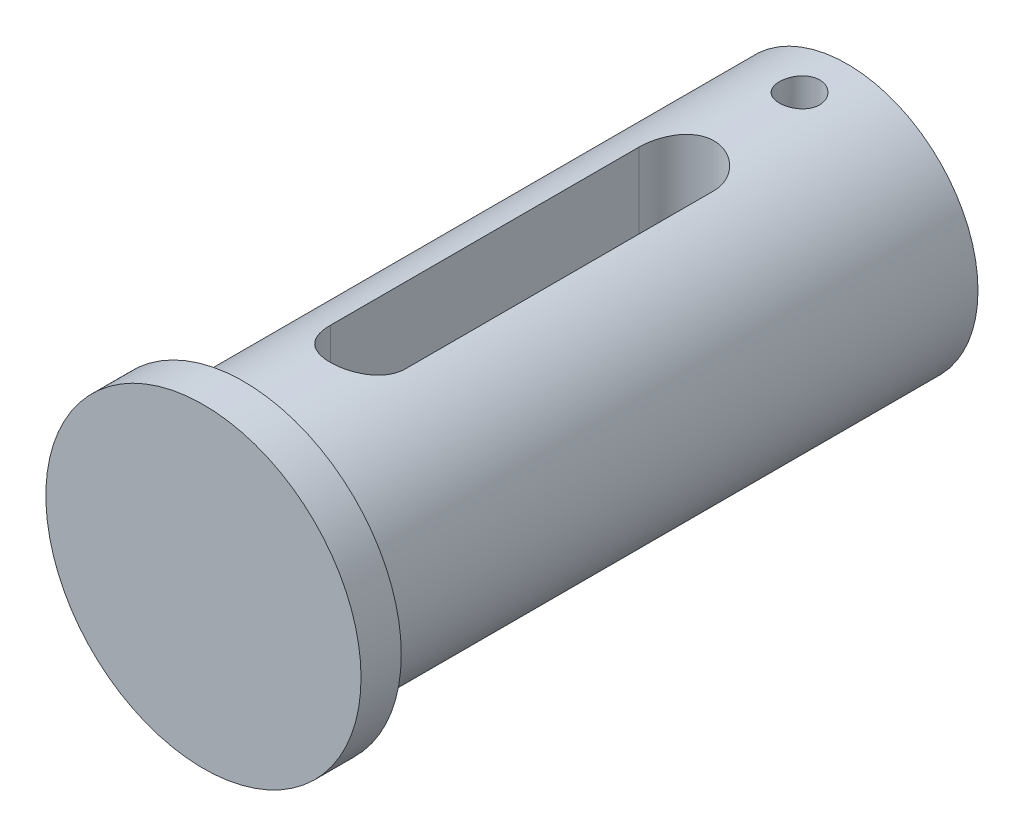
ISO-10303-21;
HEADER;
FILE_DESCRIPTION(('STEP AP214'),'2;1');
FILE_NAME('part.step','',(''),(''),'','','');
FILE_SCHEMA(('AUTOMOTIVE_DESIGN { 1 0 10303 214 1 1 1 1 }'));
ENDSEC;
DATA;
#1=APPLICATION_CONTEXT('core data for automotive mechanical design processes');
#2=APPLICATION_PROTOCOL_DEFINITION('international standard','automotive_design',2000,#1);
#3=PRODUCT_CONTEXT('',#1,'mechanical');
#4=PRODUCT('Part','Part','',(#3));
#5=PRODUCT_RELATED_PRODUCT_CATEGORY('part','',(#4));
#6=PRODUCT_DEFINITION_FORMATION('','',#4);
#7=PRODUCT_DEFINITION_CONTEXT('part definition',#1,'design');
#8=PRODUCT_DEFINITION('design','',#6,#7);
#9=PRODUCT_DEFINITION_SHAPE('','',#8);
#10=(LENGTH_UNIT() NAMED_UNIT(*) SI_UNIT(.MILLI.,.METRE.));
#11=(NAMED_UNIT(*) PLANE_ANGLE_UNIT() SI_UNIT($,.RADIAN.));
#12=(NAMED_UNIT(*) SI_UNIT($,.STERADIAN.) SOLID_ANGLE_UNIT());
#13=UNCERTAINTY_MEASURE_WITH_UNIT(LENGTH_MEASURE(1.E-05),#10,'distance_accuracy_value','');
#14=(GEOMETRIC_REPRESENTATION_CONTEXT(3) GLOBAL_UNCERTAINTY_ASSIGNED_CONTEXT((#13)) GLOBAL_UNIT_ASSIGNED_CONTEXT((#10,
#11,#12)) REPRESENTATION_CONTEXT('',''));
#15=CARTESIAN_POINT('',(0.,0.,0.));
#16=DIRECTION('',(0.,0.,1.));
#17=DIRECTION('',(1.,0.,0.));
#18=AXIS2_PLACEMENT_3D('',#15,#16,#17);
#19=CARTESIAN_POINT('',(0.,0.,45.));
#20=DIRECTION('',(0.,0.,-1.));
#21=DIRECTION('',(-1.,0.,0.));
#22=AXIS2_PLACEMENT_3D('',#19,#20,#21);
#23=CYLINDRICAL_SURFACE('',#22,9.75);
#24=CARTESIAN_POINT('',(-2.80710702041458,-9.33716499671818,12.735));
#25=CARTESIAN_POINT('',(-2.80711647680859,-9.33715477742188,12.6578056548519));
#26=CARTESIAN_POINT('',(-2.80392296997313,-9.33812206146957,12.5806172546489));
#27=CARTESIAN_POINT('',(-2.79120356748797,-9.34193572861488,12.4268264438717));
#28=CARTESIAN_POINT('',(-2.78167900147615,-9.34478171714942,12.3502239136704));
#29=CARTESIAN_POINT('',(-2.75640116002428,-9.35226800118549,12.1983275260017));
#30=CARTESIAN_POINT('',(-2.74066280357456,-9.35690399838484,12.1230309816782));
#31=CARTESIAN_POINT('',(-2.70310975166272,-9.36782137665724,11.9741108087949));
#32=CARTESIAN_POINT('',(-2.68129491716196,-9.37410279537973,11.9004872185564));
#33=CARTESIAN_POINT('',(-2.60699605085356,-9.3951453236991,11.6829321374927));
#34=CARTESIAN_POINT('',(-2.5456269616611,-9.41211437899943,11.5421338033323));
#35=CARTESIAN_POINT('',(-2.40111225217474,-9.45001092865015,11.2728387979795));
#36=CARTESIAN_POINT('',(-2.31795759988312,-9.47094006379369,11.1443472592595));
#37=CARTESIAN_POINT('',(-2.12963899864431,-9.51507820443457,10.8995326536004));
#38=CARTESIAN_POINT('',(-2.02395536297638,-9.53833258423887,10.7836167349571));
#39=CARTESIAN_POINT('',(-1.79469264677145,-9.58411305896874,10.5708849139801));
#40=CARTESIAN_POINT('',(-1.67111059637553,-9.60663903227056,10.4740721877228));
#41=CARTESIAN_POINT('',(-1.40666980537554,-9.64893867910439,10.3005390685756));
#42=CARTESIAN_POINT('',(-1.2655286237994,-9.66865227157902,10.2242331092977));
#43=CARTESIAN_POINT('',(-0.971761663430288,-9.70257722469342,10.096598853699));
#44=CARTESIAN_POINT('',(-0.819138673724752,-9.7167899164553,10.0452645139083));
#45=CARTESIAN_POINT('',(-0.511022327549508,-9.73779024363499,9.97037125977107));
#46=CARTESIAN_POINT('',(-0.355711874834096,-9.74476445481694,9.94611312491561));
#47=CARTESIAN_POINT('',(-0.0430761739848334,-9.75115737767659,9.92385407234114));
#48=CARTESIAN_POINT('',(0.114248721122642,-9.75057739558418,9.925848615153));
#49=CARTESIAN_POINT('',(0.421550126993738,-9.74206068102095,9.95556127169312));
#50=CARTESIAN_POINT('',(0.571606767177678,-9.73434045666765,9.9825223731986));
#51=CARTESIAN_POINT('',(0.864966341279789,-9.71267108001026,10.0601710203097));
#52=CARTESIAN_POINT('',(1.00826893169759,-9.69872161127369,10.1108597712362));
#53=CARTESIAN_POINT('',(1.28590487519884,-9.66585350229041,10.2350628729369));
#54=CARTESIAN_POINT('',(1.42012151115726,-9.64688161393591,10.3088234530865));
#55=CARTESIAN_POINT('',(1.67451828528519,-9.605993614126,10.4768832351377));
#56=CARTESIAN_POINT('',(1.7946955210649,-9.58407689588724,10.5711866723975));
#57=CARTESIAN_POINT('',(2.02211210305129,-9.53873662892075,10.7816045714563));
#58=CARTESIAN_POINT('',(2.12874025382918,-9.51528720928965,10.8983747933271));
#59=CARTESIAN_POINT('',(2.32108702655957,-9.47020823335739,11.1484050166293));
#60=CARTESIAN_POINT('',(2.40679969585042,-9.44857919629187,11.2816696962474));
#61=CARTESIAN_POINT('',(2.55546347861915,-9.40946802583716,11.5624313050877));
#62=CARTESIAN_POINT('',(2.61820925726902,-9.39202376086784,11.7100423715092));
#63=CARTESIAN_POINT('',(2.71770427213954,-9.36372273622855,12.014269703408));
#64=CARTESIAN_POINT('',(2.75449295952414,-9.35285598324509,12.1708719101242));
#65=CARTESIAN_POINT('',(2.78746502690079,-9.34305180133204,12.396593432866));
#66=CARTESIAN_POINT('',(2.79483051689039,-9.34084872234885,12.4640971425756));
#67=CARTESIAN_POINT('',(2.80464678896056,-9.33790535601807,12.599389345066));
#68=CARTESIAN_POINT('',(2.80710502919143,-9.33716284888515,12.667177248534));
#69=CARTESIAN_POINT('',(2.80710702041458,-9.33716499671818,12.735));
#70=B_SPLINE_CURVE_WITH_KNOTS('',3,(#24,#25,#26,#27,#28,#29,#30,#31,#32,#33,#34,#35,#36,#37,#38,
#39,#40,#41,#42,#43,#44,#45,#46,#47,#48,#49,#50,#51,#52,#53,#54,#55,#56,#57,#58,#59,#60,#61,#62,
#63,#64,#65,#66,#67,#68,#69),.UNSPECIFIED.,.F.,.F.,(4,2,2,2,2,2,2,2,2,2,2,2,2,2,2,2,2,2,2,2,2,2,
4),(0.,0.231500791144603,0.462952978256511,0.693852807333934,0.92475792016815,1.38601909052326,
1.84747179693004,2.32101780142025,2.79464247094971,3.27722076113667,3.75968220266869,
4.22937341042641,4.69898340282231,5.15480475779302,5.61064927016218,6.07153497489144,
6.53251579134957,7.0098710226999,7.48736195394646,7.96902323195447,8.44995086572629,
8.65361133400684,8.85696203807849),.UNSPECIFIED.);
#71=CARTESIAN_POINT('',(-2.80710702041458,-9.33716499671818,12.735));
#72=VERTEX_POINT('',#71);
#73=CARTESIAN_POINT('',(2.80710702041458,-9.33716499671818,12.735));
#74=VERTEX_POINT('',#73);
#75=EDGE_CURVE('E108',#72,#74,#70,.T.);
#76=ORIENTED_EDGE('',*,*,#75,.F.);
#77=DIRECTION('',(0.,0.,-1.));
#78=VECTOR('',#77,1.);
#79=CARTESIAN_POINT('',(-2.80710702041458,-9.33716499671818,45.));
#80=LINE('',#79,#78);
#81=CARTESIAN_POINT('',(-2.80710702041458,-9.33716499671818,35.735));
#82=VERTEX_POINT('',#81);
#83=EDGE_CURVE('E106',#82,#72,#80,.T.);
#84=ORIENTED_EDGE('',*,*,#83,.F.);
#85=CARTESIAN_POINT('',(2.80710702041458,-9.33716499671818,35.735));
#86=CARTESIAN_POINT('',(2.80711647680859,-9.33715477742188,35.8121943451481));
#87=CARTESIAN_POINT('',(2.80392296997313,-9.33812206146957,35.8893827453511));
#88=CARTESIAN_POINT('',(2.79120356748797,-9.34193572861488,36.0431735561283));
#89=CARTESIAN_POINT('',(2.78167900147615,-9.34478171714942,36.1197760863296));
#90=CARTESIAN_POINT('',(2.75640116002428,-9.35226800118549,36.2716724739983));
#91=CARTESIAN_POINT('',(2.74066280357456,-9.35690399838484,36.3469690183218));
#92=CARTESIAN_POINT('',(2.70310975166272,-9.36782137665724,36.4958891912051));
#93=CARTESIAN_POINT('',(2.68129491716196,-9.37410279537973,36.5695127814436));
#94=CARTESIAN_POINT('',(2.60699605085356,-9.3951453236991,36.7870678625073));
#95=CARTESIAN_POINT('',(2.5456269616611,-9.41211437899943,36.9278661966677));
#96=CARTESIAN_POINT('',(2.40111225217474,-9.45001092865015,37.1971612020205));
#97=CARTESIAN_POINT('',(2.31795759988312,-9.4709400637937,37.3256527407405));
#98=CARTESIAN_POINT('',(2.1296389986443,-9.51507820443458,37.5704673463996));
#99=CARTESIAN_POINT('',(2.02395536297638,-9.53833258423887,37.6863832650429));
#100=CARTESIAN_POINT('',(1.79469264677145,-9.58411305896874,37.89911508602));
#101=CARTESIAN_POINT('',(1.67111059637553,-9.60663903227056,37.9959278122772));
#102=CARTESIAN_POINT('',(1.40666980537553,-9.64893867910439,38.1694609314244));
#103=CARTESIAN_POINT('',(1.2655286237994,-9.66865227157902,38.2457668907023));
#104=CARTESIAN_POINT('',(0.971761663430283,-9.70257722469342,38.373401146301));
#105=CARTESIAN_POINT('',(0.819138673724748,-9.7167899164553,38.4247354860917));
#106=CARTESIAN_POINT('',(0.511022327549504,-9.73779024363499,38.4996287402289));
#107=CARTESIAN_POINT('',(0.355711874834091,-9.74476445481694,38.5238868750844));
#108=CARTESIAN_POINT('',(0.0430761739848275,-9.75115737767659,38.5461459276589));
#109=CARTESIAN_POINT('',(-0.114248721122648,-9.75057739558418,38.544151384847));
#110=CARTESIAN_POINT('',(-0.421550126993743,-9.74206068102095,38.5144387283069));
#111=CARTESIAN_POINT('',(-0.571606767177684,-9.73434045666765,38.4874776268014));
#112=CARTESIAN_POINT('',(-0.864966341279795,-9.71267108001026,38.4098289796903));
#113=CARTESIAN_POINT('',(-1.00826893169759,-9.69872161127369,38.3591402287638));
#114=CARTESIAN_POINT('',(-1.28590487519885,-9.66585350229041,38.2349371270631));
#115=CARTESIAN_POINT('',(-1.42012151115727,-9.64688161393591,38.1611765469135));
#116=CARTESIAN_POINT('',(-1.6745182852852,-9.605993614126,37.9931167648624));
#117=CARTESIAN_POINT('',(-1.79469552106491,-9.58407689588724,37.8988133276026));
#118=CARTESIAN_POINT('',(-2.02211210305129,-9.53873662892075,37.6883954285437));
#119=CARTESIAN_POINT('',(-2.12874025382918,-9.51528720928965,37.571625206673));
#120=CARTESIAN_POINT('',(-2.32108702655957,-9.47020823335739,37.3215949833707));
#121=CARTESIAN_POINT('',(-2.40679969585042,-9.44857919629187,37.1883303037526));
#122=CARTESIAN_POINT('',(-2.55546347861915,-9.40946802583716,36.9075686949123));
#123=CARTESIAN_POINT('',(-2.61820925726903,-9.39202376086784,36.7599576284908));
#124=CARTESIAN_POINT('',(-2.71770427213955,-9.36372273622855,36.455730296592));
#125=CARTESIAN_POINT('',(-2.75449295952415,-9.35285598324509,36.2991280898758));
#126=CARTESIAN_POINT('',(-2.7874650269008,-9.34305180133204,36.073406567134));
#127=CARTESIAN_POINT('',(-2.7948305168904,-9.34084872234885,36.0059028574245));
#128=CARTESIAN_POINT('',(-2.80464678896056,-9.33790535601807,35.8706106549341));
#129=CARTESIAN_POINT('',(-2.80710502919143,-9.33716284888515,35.802822751466));
#130=CARTESIAN_POINT('',(-2.80710702041458,-9.33716499671818,35.735));
#131=B_SPLINE_CURVE_WITH_KNOTS('',3,(#85,#86,#87,#88,#89,#90,#91,#92,#93,#94,#95,#96,#97,#98,
#99,#100,#101,#102,#103,#104,#105,#106,#107,#108,#109,#110,#111,#112,#113,#114,#115,#116,#117,
#118,#119,#120,#121,#122,#123,#124,#125,#126,#127,#128,#129,#130),.UNSPECIFIED.,.F.,.F.,(4,2,2,
2,2,2,2,2,2,2,2,2,2,2,2,2,2,2,2,2,2,2,4),(0.,0.2315007911446,0.462952978256501,
0.693852807333931,0.924757920168152,1.38601909052326,1.84747179693005,2.32101780142025,
2.79464247094972,3.27722076113667,3.75968220266869,4.22937341042641,4.69898340282232,
5.15480475779303,5.61064927016219,6.07153497489146,6.53251579134957,7.00987102269991,
7.48736195394646,7.96902323195448,8.4499508657263,8.65361133400685,8.85696203807848),.UNSPECIFIED.);
#132=CARTESIAN_POINT('',(2.80710702041458,-9.33716499671818,35.735));
#133=VERTEX_POINT('',#132);
#134=EDGE_CURVE('E92',#133,#82,#131,.T.);
#135=ORIENTED_EDGE('',*,*,#134,.F.);
#136=DIRECTION('',(0.,0.,-1.));
#137=VECTOR('',#136,1.);
#138=CARTESIAN_POINT('',(2.80710702041458,-9.33716499671818,45.));
#139=LINE('',#138,#137);
#140=EDGE_CURVE('E87',#74,#133,#139,.F.);
#141=ORIENTED_EDGE('',*,*,#140,.F.);
#142=EDGE_LOOP('',(#76,#84,#135,#141));
#143=FACE_BOUND('',#142,.T.);
#144=CARTESIAN_POINT('',(0.,0.,45.));
#145=DIRECTION('',(0.,0.,1.));
#146=DIRECTION('',(1.,0.,0.));
#147=AXIS2_PLACEMENT_3D('',#144,#145,#146);
#148=CIRCLE('',#147,9.75);
#149=CARTESIAN_POINT('',(9.75,0.,45.));
#150=VERTEX_POINT('',#149);
#151=EDGE_CURVE('E93',#150,#150,#148,.T.);
#152=ORIENTED_EDGE('',*,*,#151,.F.);
#153=EDGE_LOOP('',(#152));
#154=FACE_BOUND('',#153,.T.);
#155=CARTESIAN_POINT('',(0.,0.,0.));
#156=DIRECTION('',(0.,0.,1.));
#157=DIRECTION('',(1.,0.,0.));
#158=AXIS2_PLACEMENT_3D('',#155,#156,#157);
#159=CIRCLE('',#158,9.75);
#160=CARTESIAN_POINT('',(9.75,0.,0.));
#161=VERTEX_POINT('',#160);
#162=EDGE_CURVE('E164',#161,#161,#159,.T.);
#163=ORIENTED_EDGE('',*,*,#162,.T.);
#164=EDGE_LOOP('',(#163));
#165=FACE_BOUND('',#164,.T.);
#166=CARTESIAN_POINT('',(2.80710702041458,9.33716499671818,12.735));
#167=CARTESIAN_POINT('',(2.80711647680859,9.33715477742188,12.6578056548519));
#168=CARTESIAN_POINT('',(2.80392296997313,9.33812206146957,12.5806172546489));
#169=CARTESIAN_POINT('',(2.79120356748797,9.34193572861488,12.4268264438717));
#170=CARTESIAN_POINT('',(2.78167900147615,9.34478171714942,12.3502239136704));
#171=CARTESIAN_POINT('',(2.75640116002428,9.35226800118549,12.1983275260017));
#172=CARTESIAN_POINT('',(2.74066280357456,9.35690399838484,12.1230309816782));
#173=CARTESIAN_POINT('',(2.70310975166272,9.36782137665724,11.9741108087949));
#174=CARTESIAN_POINT('',(2.68129491716196,9.37410279537973,11.9004872185564));
#175=CARTESIAN_POINT('',(2.60699605085356,9.3951453236991,11.6829321374927));
#176=CARTESIAN_POINT('',(2.5456269616611,9.41211437899943,11.5421338033323));
#177=CARTESIAN_POINT('',(2.40111225217474,9.45001092865016,11.2728387979795));
#178=CARTESIAN_POINT('',(2.31795759988312,9.47094006379369,11.1443472592595));
#179=CARTESIAN_POINT('',(2.12963899864431,9.51507820443457,10.8995326536004));
#180=CARTESIAN_POINT('',(2.02395536297638,9.53833258423887,10.7836167349571));
#181=CARTESIAN_POINT('',(1.79469264677145,9.58411305896874,10.5708849139801));
#182=CARTESIAN_POINT('',(1.67111059637553,9.60663903227056,10.4740721877228));
#183=CARTESIAN_POINT('',(1.40666980537554,9.64893867910439,10.3005390685756));
#184=CARTESIAN_POINT('',(1.2655286237994,9.66865227157902,10.2242331092977));
#185=CARTESIAN_POINT('',(0.971761663430288,9.70257722469342,10.096598853699));
#186=CARTESIAN_POINT('',(0.819138673724752,9.7167899164553,10.0452645139083));
#187=CARTESIAN_POINT('',(0.511022327549508,9.73779024363499,9.97037125977107));
#188=CARTESIAN_POINT('',(0.355711874834095,9.74476445481694,9.94611312491561));
#189=CARTESIAN_POINT('',(0.0430761739848329,9.75115737767659,9.92385407234114));
#190=CARTESIAN_POINT('',(-0.114248721122643,9.75057739558418,9.925848615153));
#191=CARTESIAN_POINT('',(-0.421550126993738,9.74206068102095,9.95556127169312));
#192=CARTESIAN_POINT('',(-0.571606767177678,9.73434045666765,9.9825223731986));
#193=CARTESIAN_POINT('',(-0.864966341279789,9.71267108001026,10.0601710203097));
#194=CARTESIAN_POINT('',(-1.00826893169759,9.69872161127369,10.1108597712362));
#195=CARTESIAN_POINT('',(-1.28590487519884,9.66585350229041,10.2350628729369));
#196=CARTESIAN_POINT('',(-1.42012151115726,9.64688161393591,10.3088234530865));
#197=CARTESIAN_POINT('',(-1.6745182852852,9.605993614126,10.4768832351377));
#198=CARTESIAN_POINT('',(-1.7946955210649,9.58407689588724,10.5711866723975));
#199=CARTESIAN_POINT('',(-2.02211210305129,9.53873662892075,10.7816045714563));
#200=CARTESIAN_POINT('',(-2.12874025382918,9.51528720928965,10.8983747933271));
#201=CARTESIAN_POINT('',(-2.32108702655957,9.47020823335739,11.1484050166293));
#202=CARTESIAN_POINT('',(-2.40679969585042,9.44857919629187,11.2816696962474));
#203=CARTESIAN_POINT('',(-2.55546347861915,9.40946802583716,11.5624313050877));
#204=CARTESIAN_POINT('',(-2.61820925726902,9.39202376086784,11.7100423715092));
#205=CARTESIAN_POINT('',(-2.71770427213954,9.36372273622855,12.014269703408));
#206=CARTESIAN_POINT('',(-2.75449295952414,9.35285598324509,12.1708719101242));
#207=CARTESIAN_POINT('',(-2.78746502690079,9.34305180133204,12.396593432866));
#208=CARTESIAN_POINT('',(-2.7948305168904,9.34084872234885,12.4640971425756));
#209=CARTESIAN_POINT('',(-2.80464678896056,9.33790535601807,12.599389345066));
#210=CARTESIAN_POINT('',(-2.80710502919143,9.33716284888515,12.667177248534));
#211=CARTESIAN_POINT('',(-2.80710702041458,9.33716499671818,12.735));
#212=B_SPLINE_CURVE_WITH_KNOTS('',3,(#166,#167,#168,#169,#170,#171,#172,#173,#174,#175,#176,
#177,#178,#179,#180,#181,#182,#183,#184,#185,#186,#187,#188,#189,#190,#191,#192,#193,#194,#195,
#196,#197,#198,#199,#200,#201,#202,#203,#204,#205,#206,#207,#208,#209,#210,#211),.UNSPECIFIED.,
.F.,.F.,(4,2,2,2,2,2,2,2,2,2,2,2,2,2,2,2,2,2,2,2,2,2,4),(0.,0.231500791144603,0.462952978256511,
0.693852807333936,0.92475792016815,1.38601909052326,1.84747179693004,2.32101780142024,
2.79464247094971,3.27722076113667,3.75968220266869,4.22937341042641,4.69898340282231,
5.15480475779302,5.61064927016218,6.07153497489144,6.53251579134957,7.0098710226999,
7.48736195394646,7.96902323195447,8.44995086572629,8.65361133400684,8.85696203807849),.UNSPECIFIED.);
#213=CARTESIAN_POINT('',(2.80710702041458,9.33716499671818,12.735));
#214=VERTEX_POINT('',#213);
#215=CARTESIAN_POINT('',(-2.80710702041458,9.33716499671818,12.735));
#216=VERTEX_POINT('',#215);
#217=EDGE_CURVE('E13',#214,#216,#212,.T.);
#218=ORIENTED_EDGE('',*,*,#217,.F.);
#219=DIRECTION('',(0.,0.,-1.));
#220=VECTOR('',#219,1.);
#221=CARTESIAN_POINT('',(2.80710702041458,9.33716499671818,45.));
#222=LINE('',#221,#220);
#223=CARTESIAN_POINT('',(2.80710702041458,9.33716499671818,35.735));
#224=VERTEX_POINT('',#223);
#225=EDGE_CURVE('E129',#224,#214,#222,.T.);
#226=ORIENTED_EDGE('',*,*,#225,.F.);
#227=CARTESIAN_POINT('',(-2.80710702041458,9.33716499671818,35.735));
#228=CARTESIAN_POINT('',(-2.80711647680859,9.33715477742187,35.8121943451481));
#229=CARTESIAN_POINT('',(-2.80392296997313,9.33812206146957,35.8893827453511));
#230=CARTESIAN_POINT('',(-2.79120356748797,9.34193572861488,36.0431735561283));
#231=CARTESIAN_POINT('',(-2.78167900147615,9.34478171714942,36.1197760863296));
#232=CARTESIAN_POINT('',(-2.75640116002428,9.35226800118549,36.2716724739983));
#233=CARTESIAN_POINT('',(-2.74066280357457,9.35690399838484,36.3469690183218));
#234=CARTESIAN_POINT('',(-2.70310975166272,9.36782137665724,36.4958891912051));
#235=CARTESIAN_POINT('',(-2.68129491716197,9.37410279537973,36.5695127814436));
#236=CARTESIAN_POINT('',(-2.60699605085356,9.3951453236991,36.7870678625073));
#237=CARTESIAN_POINT('',(-2.5456269616611,9.41211437899942,36.9278661966677));
#238=CARTESIAN_POINT('',(-2.40111225217474,9.45001092865015,37.1971612020205));
#239=CARTESIAN_POINT('',(-2.31795759988312,9.47094006379369,37.3256527407405));
#240=CARTESIAN_POINT('',(-2.12963899864431,9.51507820443457,37.5704673463996));
#241=CARTESIAN_POINT('',(-2.02395536297638,9.53833258423887,37.6863832650429));
#242=CARTESIAN_POINT('',(-1.79469264677145,9.58411305896874,37.89911508602));
#243=CARTESIAN_POINT('',(-1.67111059637553,9.60663903227056,37.9959278122772));
#244=CARTESIAN_POINT('',(-1.40666980537554,9.64893867910439,38.1694609314244));
#245=CARTESIAN_POINT('',(-1.2655286237994,9.66865227157902,38.2457668907023));
#246=CARTESIAN_POINT('',(-0.971761663430287,9.70257722469342,38.373401146301));
#247=CARTESIAN_POINT('',(-0.819138673724752,9.7167899164553,38.4247354860917));
#248=CARTESIAN_POINT('',(-0.51102232754951,9.73779024363499,38.4996287402289));
#249=CARTESIAN_POINT('',(-0.355711874834096,9.74476445481694,38.5238868750844));
#250=CARTESIAN_POINT('',(-0.0430761739848332,9.75115737767659,38.5461459276589));
#251=CARTESIAN_POINT('',(0.114248721122643,9.75057739558418,38.544151384847));
#252=CARTESIAN_POINT('',(0.421550126993738,9.74206068102095,38.5144387283069));
#253=CARTESIAN_POINT('',(0.571606767177679,9.73434045666765,38.4874776268014));
#254=CARTESIAN_POINT('',(0.86496634127979,9.71267108001026,38.4098289796903));
#255=CARTESIAN_POINT('',(1.00826893169759,9.69872161127369,38.3591402287638));
#256=CARTESIAN_POINT('',(1.28590487519884,9.66585350229041,38.2349371270631));
#257=CARTESIAN_POINT('',(1.42012151115727,9.64688161393591,38.1611765469135));
#258=CARTESIAN_POINT('',(1.6745182852852,9.605993614126,37.9931167648624));
#259=CARTESIAN_POINT('',(1.7946955210649,9.58407689588724,37.8988133276026));
#260=CARTESIAN_POINT('',(2.02211210305129,9.53873662892075,37.6883954285437));
#261=CARTESIAN_POINT('',(2.12874025382918,9.51528720928965,37.571625206673));
#262=CARTESIAN_POINT('',(2.32108702655957,9.47020823335739,37.3215949833707));
#263=CARTESIAN_POINT('',(2.40679969585042,9.44857919629187,37.1883303037526));
#264=CARTESIAN_POINT('',(2.55546347861915,9.40946802583716,36.9075686949123));
#265=CARTESIAN_POINT('',(2.61820925726902,9.39202376086784,36.7599576284908));
#266=CARTESIAN_POINT('',(2.71770427213954,9.36372273622855,36.455730296592));
#267=CARTESIAN_POINT('',(2.75449295952414,9.35285598324509,36.2991280898759));
#268=CARTESIAN_POINT('',(2.78746502690079,9.34305180133204,36.073406567134));
#269=CARTESIAN_POINT('',(2.79483051689039,9.34084872234885,36.0059028574245));
#270=CARTESIAN_POINT('',(2.80464678896056,9.33790535601808,35.8706106549341));
#271=CARTESIAN_POINT('',(2.80710502919143,9.33716284888515,35.802822751466));
#272=CARTESIAN_POINT('',(2.80710702041458,9.33716499671818,35.735));
#273=B_SPLINE_CURVE_WITH_KNOTS('',3,(#227,#228,#229,#230,#231,#232,#233,#234,#235,#236,#237,
#238,#239,#240,#241,#242,#243,#244,#245,#246,#247,#248,#249,#250,#251,#252,#253,#254,#255,#256,
#257,#258,#259,#260,#261,#262,#263,#264,#265,#266,#267,#268,#269,#270,#271,#272),.UNSPECIFIED.,
.F.,.F.,(4,2,2,2,2,2,2,2,2,2,2,2,2,2,2,2,2,2,2,2,2,2,4),(0.,0.2315007911446,0.462952978256501,
0.693852807333931,0.924757920168152,1.38601909052326,1.84747179693005,2.32101780142025,
2.79464247094972,3.27722076113667,3.75968220266869,4.22937341042641,4.69898340282232,
5.15480475779303,5.61064927016219,6.07153497489145,6.53251579134957,7.00987102269991,
7.48736195394646,7.96902323195448,8.44995086572629,8.65361133400685,8.85696203807848),.UNSPECIFIED.);
#274=CARTESIAN_POINT('',(-2.80710702041458,9.33716499671818,35.735));
#275=VERTEX_POINT('',#274);
#276=EDGE_CURVE('E100',#275,#224,#273,.T.);
#277=ORIENTED_EDGE('',*,*,#276,.F.);
#278=DIRECTION('',(0.,0.,-1.));
#279=VECTOR('',#278,1.);
#280=CARTESIAN_POINT('',(-2.80710702041458,9.33716499671818,45.));
#281=LINE('',#280,#279);
#282=EDGE_CURVE('E57',#216,#275,#281,.F.);
#283=ORIENTED_EDGE('',*,*,#282,.F.);
#284=EDGE_LOOP('',(#218,#226,#277,#283));
#285=FACE_BOUND('',#284,.T.);
#286=CARTESIAN_POINT('',(0.,-9.75000000000001,2.0566495420033));
#287=CARTESIAN_POINT('',(0.083725597094829,-9.7499986348825,2.0566529747508));
#288=CARTESIAN_POINT('',(0.16749913719684,-9.74891025514912,2.06368318647801));
#289=CARTESIAN_POINT('',(0.332702849736005,-9.74467325345893,2.0916101517857));
#290=CARTESIAN_POINT('',(0.414130689920022,-9.74152265022295,2.11252024071748));
#291=CARTESIAN_POINT('',(0.57222841632527,-9.73351510877682,2.16756587550462));
#292=CARTESIAN_POINT('',(0.648901912071875,-9.72865948416262,2.20169124201784));
#293=CARTESIAN_POINT('',(0.795423127906569,-9.71777785476949,2.28217345821688));
#294=CARTESIAN_POINT('',(0.865271756957842,-9.71175200616593,2.32852867603077));
#295=CARTESIAN_POINT('',(0.996744579018559,-9.69914430233968,2.4325596322858));
#296=CARTESIAN_POINT('',(1.05830469109658,-9.69255869318027,2.49031590891403));
#297=CARTESIAN_POINT('',(1.17089998678124,-9.67960294435345,2.61533616822456));
#298=CARTESIAN_POINT('',(1.22193455236823,-9.67323281735669,2.68260070880499));
#299=CARTESIAN_POINT('',(1.31228118175537,-9.66139287721394,2.82516083409269));
#300=CARTESIAN_POINT('',(1.35153093772537,-9.65592791564851,2.90049634395212));
#301=CARTESIAN_POINT('',(1.41679554994362,-9.64656851529946,3.05678870130232));
#302=CARTESIAN_POINT('',(1.44281116544679,-9.64267398642131,3.13774522600734));
#303=CARTESIAN_POINT('',(1.48066934349271,-9.63693341822236,3.30230638521919));
#304=CARTESIAN_POINT('',(1.49262182606832,-9.6350715000295,3.38588516791716));
#305=CARTESIAN_POINT('',(1.50235503698613,-9.63355879918595,3.55388123943183));
#306=CARTESIAN_POINT('',(1.50013662076864,-9.63390788306592,3.6382984773272));
#307=CARTESIAN_POINT('',(1.48168076971774,-9.63676322899689,3.80479686975089));
#308=CARTESIAN_POINT('',(1.46556599166247,-9.63925061663173,3.8868919908357));
#309=CARTESIAN_POINT('',(1.41996697045862,-9.64607280652549,4.04719910370161));
#310=CARTESIAN_POINT('',(1.39048233116554,-9.65040766352407,4.12541098034731));
#311=CARTESIAN_POINT('',(1.31885369262605,-9.66045710938216,4.27610331527908));
#312=CARTESIAN_POINT('',(1.27665796620735,-9.66617731685081,4.34855879601201));
#313=CARTESIAN_POINT('',(1.18084174856116,-9.67834891554285,4.48540735400489));
#314=CARTESIAN_POINT('',(1.12722046918666,-9.6848003571932,4.54979987458636));
#315=CARTESIAN_POINT('',(1.00940308058212,-9.69779080134088,4.66940532493529));
#316=CARTESIAN_POINT('',(0.945101562936527,-9.704330010507,4.72451445255872));
#317=CARTESIAN_POINT('',(0.808107626798422,-9.71669616062019,4.82317521987657));
#318=CARTESIAN_POINT('',(0.735415168027881,-9.72252309814795,4.86672680408939));
#319=CARTESIAN_POINT('',(0.583611156916405,-9.73281471818099,4.94104246089643));
#320=CARTESIAN_POINT('',(0.504495494447522,-9.73727851959584,4.9717982673165));
#321=CARTESIAN_POINT('',(0.342138061268064,-9.7443336217095,5.01955773456101));
#322=CARTESIAN_POINT('',(0.258896584584565,-9.74692505563855,5.03656237387424));
#323=CARTESIAN_POINT('',(0.0915460602422239,-9.74992573320674,5.05619818313771));
#324=CARTESIAN_POINT('',(0.00745412561123875,-9.75035663466449,5.05897201350275));
#325=CARTESIAN_POINT('',(-0.159993794019548,-9.74904673183848,5.05044650230013));
#326=CARTESIAN_POINT('',(-0.243349802933036,-9.74730599838487,5.03914761972873));
#327=CARTESIAN_POINT('',(-0.406525686372383,-9.74186181283924,5.00291605404663));
#328=CARTESIAN_POINT('',(-0.48636141279672,-9.73816840534847,4.97805312402862));
#329=CARTESIAN_POINT('',(-0.640731215954756,-9.72923158047685,4.91547296623169));
#330=CARTESIAN_POINT('',(-0.715265032392349,-9.72398808705995,4.87775510786863));
#331=CARTESIAN_POINT('',(-0.857540894363581,-9.71247974824997,4.79020284191346));
#332=CARTESIAN_POINT('',(-0.925226823744649,-9.70620742044751,4.74027824518695));
#333=CARTESIAN_POINT('',(-1.05131054638893,-9.69336216313701,4.62985490993898));
#334=CARTESIAN_POINT('',(-1.10970776980821,-9.68678921521833,4.56935552315236));
#335=CARTESIAN_POINT('',(-1.21607765382797,-9.67401455215288,4.43886379379129));
#336=CARTESIAN_POINT('',(-1.26395451190598,-9.66781659348622,4.36879293396274));
#337=CARTESIAN_POINT('',(-1.34725800281441,-9.65656099571451,4.22151975966461));
#338=CARTESIAN_POINT('',(-1.38268498558581,-9.6515033245597,4.1443176457173));
#339=CARTESIAN_POINT('',(-1.43993574915646,-9.64312836811527,3.98525516576475));
#340=CARTESIAN_POINT('',(-1.46180933836865,-9.63980471754412,3.90341307712214));
#341=CARTESIAN_POINT('',(-1.49149055433532,-9.63525740324653,3.7371617828509));
#342=CARTESIAN_POINT('',(-1.49929920752474,-9.63403358627814,3.65275276500957));
#343=CARTESIAN_POINT('',(-1.50060353592778,-9.63383042474114,3.4847189393192));
#344=CARTESIAN_POINT('',(-1.49424987819352,-9.63482745342316,3.40109529075197));
#345=CARTESIAN_POINT('',(-1.4677334610574,-9.63890219891737,3.23612113446272));
#346=CARTESIAN_POINT('',(-1.44757072847217,-9.64197991168895,3.15477062232668));
#347=CARTESIAN_POINT('',(-1.39406278656465,-9.64986082413317,2.99669741107507));
#348=CARTESIAN_POINT('',(-1.36072865276843,-9.6546625737941,2.91997088606899));
#349=CARTESIAN_POINT('',(-1.28183922882435,-9.66545220330251,2.77317504026746));
#350=CARTESIAN_POINT('',(-1.23628348168486,-9.67144012750134,2.70310596854078));
#351=CARTESIAN_POINT('',(-1.13369872530266,-9.68400314974483,2.57084946914524));
#352=CARTESIAN_POINT('',(-1.07655828443068,-9.69058357619951,2.50874896902677));
#353=CARTESIAN_POINT('',(-0.952661636989767,-9.70354611571483,2.39496497053128));
#354=CARTESIAN_POINT('',(-0.885903202579084,-9.70992818241133,2.34328389230613));
#355=CARTESIAN_POINT('',(-0.744208291722618,-9.72181740658485,2.25153613141942));
#356=CARTESIAN_POINT('',(-0.669226574652068,-9.72731926800759,2.21153863945901));
#357=CARTESIAN_POINT('',(-0.513558845114152,-9.73677636223739,2.14476594443203));
#358=CARTESIAN_POINT('',(-0.432878788430056,-9.7407331824475,2.11797716302256));
#359=CARTESIAN_POINT('',(-0.293206050051813,-9.74575992960912,2.08440168890125));
#360=CARTESIAN_POINT('',(-0.235071881494887,-9.74734171665109,2.07401070590828));
#361=CARTESIAN_POINT('',(-0.117966402295774,-9.74946222579788,2.06013346937311));
#362=CARTESIAN_POINT('',(-0.0589951028943543,-9.75000096189518,2.05664712320547));
#363=CARTESIAN_POINT('',(0.,-9.75000000000001,2.0566495420033));
#364=B_SPLINE_CURVE_WITH_KNOTS('',3,(#286,#287,#288,#289,#290,#291,#292,#293,#294,#295,#296,
#297,#298,#299,#300,#301,#302,#303,#304,#305,#306,#307,#308,#309,#310,#311,#312,#313,#314,#315,
#316,#317,#318,#319,#320,#321,#322,#323,#324,#325,#326,#327,#328,#329,#330,#331,#332,#333,#334,
#335,#336,#337,#338,#339,#340,#341,#342,#343,#344,#345,#346,#347,#348,#349,#350,#351,#352,#353,
#354,#355,#356,#357,#358,#359,#360,#361,#362,#363),.UNSPECIFIED.,.T.,.F.,(4,2,2,2,2,2,2,2,2,2,2,
2,2,2,2,2,2,2,2,2,2,2,2,2,2,2,2,2,2,2,2,2,2,2,2,2,2,2,4),(0.,0.250961201552066,
0.502163868434215,0.753173424881516,1.00414950516837,1.25696640495315,1.50979814495153,
1.76394400843765,2.01807528969484,2.2702067528846,2.52232299605342,2.77223644097262,
3.02215729122692,3.27310924639009,3.52407851809841,3.77769052368227,4.03130374670016,
4.28508055243103,4.53883929863203,4.79004913375708,5.0412507756251,5.29117262604935,
5.54110673787573,5.79294645408347,6.04480161421085,6.29886307150861,6.55291738707789,
6.80603243366951,7.05912900761014,7.30954585520341,7.55996221649943,7.81016845506579,
8.06038405066987,8.31313153834377,8.56593766500666,8.82021190215866,9.07422420165252,
9.25105997280002,9.42789337168621),.UNSPECIFIED.);
#365=CARTESIAN_POINT('',(0.,-9.75000000000001,2.0566495420033));
#366=VERTEX_POINT('',#365);
#367=EDGE_CURVE('E133',#366,#366,#364,.T.);
#368=ORIENTED_EDGE('',*,*,#367,.F.);
#369=EDGE_LOOP('',(#368));
#370=FACE_BOUND('',#369,.T.);
#371=CARTESIAN_POINT('',(0.,9.75,2.0566495420033));
#372=CARTESIAN_POINT('',(-0.083725597094829,9.74999863488249,2.0566529747508));
#373=CARTESIAN_POINT('',(-0.16749913719684,9.74891025514911,2.06368318647801));
#374=CARTESIAN_POINT('',(-0.332702849736005,9.74467325345894,2.0916101517857));
#375=CARTESIAN_POINT('',(-0.414130689920022,9.74152265022295,2.11252024071748));
#376=CARTESIAN_POINT('',(-0.57222841632527,9.73351510877682,2.16756587550462));
#377=CARTESIAN_POINT('',(-0.648901912071875,9.72865948416261,2.20169124201784));
#378=CARTESIAN_POINT('',(-0.795423127906569,9.71777785476948,2.28217345821688));
#379=CARTESIAN_POINT('',(-0.865271756957842,9.71175200616593,2.32852867603077));
#380=CARTESIAN_POINT('',(-0.996744579018559,9.69914430233968,2.4325596322858));
#381=CARTESIAN_POINT('',(-1.05830469109658,9.69255869318027,2.49031590891403));
#382=CARTESIAN_POINT('',(-1.17089998678124,9.67960294435345,2.61533616822456));
#383=CARTESIAN_POINT('',(-1.22193455236823,9.67323281735669,2.68260070880499));
#384=CARTESIAN_POINT('',(-1.31228118175537,9.66139287721394,2.82516083409269));
#385=CARTESIAN_POINT('',(-1.35153093772537,9.65592791564851,2.90049634395212));
#386=CARTESIAN_POINT('',(-1.41679554994362,9.64656851529946,3.05678870130232));
#387=CARTESIAN_POINT('',(-1.44281116544679,9.64267398642131,3.13774522600734));
#388=CARTESIAN_POINT('',(-1.48066934349271,9.63693341822236,3.30230638521919));
#389=CARTESIAN_POINT('',(-1.49262182606832,9.6350715000295,3.38588516791716));
#390=CARTESIAN_POINT('',(-1.50235503698613,9.63355879918595,3.55388123943183));
#391=CARTESIAN_POINT('',(-1.50013662076864,9.63390788306592,3.6382984773272));
#392=CARTESIAN_POINT('',(-1.48168076971774,9.63676322899689,3.80479686975089));
#393=CARTESIAN_POINT('',(-1.46556599166247,9.63925061663173,3.8868919908357));
#394=CARTESIAN_POINT('',(-1.41996697045862,9.64607280652549,4.04719910370161));
#395=CARTESIAN_POINT('',(-1.39048233116554,9.65040766352407,4.12541098034731));
#396=CARTESIAN_POINT('',(-1.31885369262605,9.66045710938216,4.27610331527908));
#397=CARTESIAN_POINT('',(-1.27665796620735,9.66617731685081,4.34855879601201));
#398=CARTESIAN_POINT('',(-1.18084174856116,9.67834891554285,4.48540735400489));
#399=CARTESIAN_POINT('',(-1.12722046918666,9.6848003571932,4.54979987458636));
#400=CARTESIAN_POINT('',(-1.00940308058212,9.69779080134088,4.66940532493529));
#401=CARTESIAN_POINT('',(-0.945101562936527,9.704330010507,4.72451445255872));
#402=CARTESIAN_POINT('',(-0.808107626798422,9.71669616062019,4.82317521987657));
#403=CARTESIAN_POINT('',(-0.735415168027881,9.72252309814795,4.86672680408939));
#404=CARTESIAN_POINT('',(-0.583611156916405,9.73281471818099,4.94104246089643));
#405=CARTESIAN_POINT('',(-0.504495494447522,9.73727851959584,4.9717982673165));
#406=CARTESIAN_POINT('',(-0.342138061268064,9.7443336217095,5.01955773456101));
#407=CARTESIAN_POINT('',(-0.258896584584565,9.74692505563855,5.03656237387424));
#408=CARTESIAN_POINT('',(-0.0915460602422239,9.74992573320674,5.05619818313771));
#409=CARTESIAN_POINT('',(-0.00745412561123875,9.75035663466449,5.05897201350275));
#410=CARTESIAN_POINT('',(0.159993794019548,9.74904673183848,5.05044650230013));
#411=CARTESIAN_POINT('',(0.243349802933036,9.74730599838487,5.03914761972873));
#412=CARTESIAN_POINT('',(0.406525686372383,9.74186181283924,5.00291605404663));
#413=CARTESIAN_POINT('',(0.48636141279672,9.73816840534847,4.97805312402862));
#414=CARTESIAN_POINT('',(0.640731215954756,9.72923158047685,4.91547296623169));
#415=CARTESIAN_POINT('',(0.715265032392349,9.72398808705995,4.87775510786863));
#416=CARTESIAN_POINT('',(0.857540894363581,9.71247974824997,4.79020284191346));
#417=CARTESIAN_POINT('',(0.925226823744649,9.70620742044751,4.74027824518695));
#418=CARTESIAN_POINT('',(1.05131054638893,9.69336216313701,4.62985490993898));
#419=CARTESIAN_POINT('',(1.10970776980821,9.68678921521833,4.56935552315236));
#420=CARTESIAN_POINT('',(1.21607765382797,9.67401455215288,4.43886379379129));
#421=CARTESIAN_POINT('',(1.26395451190598,9.66781659348622,4.36879293396274));
#422=CARTESIAN_POINT('',(1.34725800281441,9.65656099571451,4.22151975966461));
#423=CARTESIAN_POINT('',(1.38268498558581,9.6515033245597,4.1443176457173));
#424=CARTESIAN_POINT('',(1.43993574915646,9.64312836811527,3.98525516576475));
#425=CARTESIAN_POINT('',(1.46180933836865,9.63980471754412,3.90341307712214));
#426=CARTESIAN_POINT('',(1.49149055433532,9.63525740324653,3.7371617828509));
#427=CARTESIAN_POINT('',(1.49929920752474,9.63403358627814,3.65275276500957));
#428=CARTESIAN_POINT('',(1.50060353592778,9.63383042474114,3.4847189393192));
#429=CARTESIAN_POINT('',(1.49424987819352,9.63482745342316,3.40109529075197));
#430=CARTESIAN_POINT('',(1.4677334610574,9.63890219891737,3.23612113446272));
#431=CARTESIAN_POINT('',(1.44757072847217,9.64197991168895,3.15477062232668));
#432=CARTESIAN_POINT('',(1.39406278656465,9.64986082413317,2.99669741107507));
#433=CARTESIAN_POINT('',(1.36072865276843,9.6546625737941,2.91997088606899));
#434=CARTESIAN_POINT('',(1.28183922882435,9.66545220330251,2.77317504026746));
#435=CARTESIAN_POINT('',(1.23628348168486,9.67144012750134,2.70310596854078));
#436=CARTESIAN_POINT('',(1.13369872530266,9.68400314974483,2.57084946914524));
#437=CARTESIAN_POINT('',(1.07655828443068,9.69058357619951,2.50874896902677));
#438=CARTESIAN_POINT('',(0.952661636989767,9.70354611571483,2.39496497053128));
#439=CARTESIAN_POINT('',(0.885903202579084,9.70992818241133,2.34328389230613));
#440=CARTESIAN_POINT('',(0.744208291722618,9.72181740658485,2.25153613141942));
#441=CARTESIAN_POINT('',(0.669226574652068,9.72731926800759,2.21153863945901));
#442=CARTESIAN_POINT('',(0.513558845114152,9.73677636223739,2.14476594443203));
#443=CARTESIAN_POINT('',(0.432878788430056,9.7407331824475,2.11797716302256));
#444=CARTESIAN_POINT('',(0.293206050051813,9.74575992960912,2.08440168890125));
#445=CARTESIAN_POINT('',(0.235071881494887,9.74734171665109,2.07401070590828));
#446=CARTESIAN_POINT('',(0.117966402295774,9.74946222579788,2.06013346937311));
#447=CARTESIAN_POINT('',(0.0589951028943543,9.75000096189517,2.05664712320547));
#448=CARTESIAN_POINT('',(0.,9.75,2.0566495420033));
#449=B_SPLINE_CURVE_WITH_KNOTS('',3,(#371,#372,#373,#374,#375,#376,#377,#378,#379,#380,#381,
#382,#383,#384,#385,#386,#387,#388,#389,#390,#391,#392,#393,#394,#395,#396,#397,#398,#399,#400,
#401,#402,#403,#404,#405,#406,#407,#408,#409,#410,#411,#412,#413,#414,#415,#416,#417,#418,#419,
#420,#421,#422,#423,#424,#425,#426,#427,#428,#429,#430,#431,#432,#433,#434,#435,#436,#437,#438,
#439,#440,#441,#442,#443,#444,#445,#446,#447,#448),.UNSPECIFIED.,.T.,.F.,(4,2,2,2,2,2,2,2,2,2,2,
2,2,2,2,2,2,2,2,2,2,2,2,2,2,2,2,2,2,2,2,2,2,2,2,2,2,2,4),(0.,0.250961201552066,
0.502163868434215,0.753173424881516,1.00414950516837,1.25696640495315,1.50979814495153,
1.76394400843765,2.01807528969484,2.2702067528846,2.52232299605342,2.77223644097262,
3.02215729122692,3.27310924639009,3.52407851809841,3.77769052368227,4.03130374670016,
4.28508055243103,4.53883929863203,4.79004913375708,5.0412507756251,5.29117262604935,
5.54110673787573,5.79294645408347,6.04480161421085,6.29886307150861,6.55291738707789,
6.80603243366951,7.05912900761014,7.30954585520341,7.55996221649943,7.81016845506579,
8.06038405066987,8.31313153834377,8.56593766500666,8.82021190215866,9.07422420165252,
9.25105997280002,9.42789337168621),.UNSPECIFIED.);
#450=CARTESIAN_POINT('',(0.,9.75,2.0566495420033));
#451=VERTEX_POINT('',#450);
#452=EDGE_CURVE('E49',#451,#451,#449,.T.);
#453=ORIENTED_EDGE('',*,*,#452,.F.);
#454=EDGE_LOOP('',(#453));
#455=FACE_BOUND('',#454,.T.);
#456=ADVANCED_FACE('F45',(#143,#154,#165,#285,#370,#455),#23,.T.);
#457=CARTESIAN_POINT('',(0.,0.,0.));
#458=DIRECTION('',(0.,0.,1.));
#459=DIRECTION('',(1.,0.,0.));
#460=AXIS2_PLACEMENT_3D('',#457,#458,#459);
#461=PLANE('',#460);
#462=ORIENTED_EDGE('',*,*,#162,.F.);
#463=EDGE_LOOP('',(#462));
#464=FACE_BOUND('',#463,.T.);
#465=ADVANCED_FACE('F172',(#464),#461,.F.);
#466=CARTESIAN_POINT('',(0.,0.,48.));
#467=DIRECTION('',(0.,0.,-1.));
#468=DIRECTION('',(-1.,0.,0.));
#469=AXIS2_PLACEMENT_3D('',#466,#467,#468);
#470=CYLINDRICAL_SURFACE('',#469,11.75);
#471=CARTESIAN_POINT('',(0.,0.,48.));
#472=DIRECTION('',(0.,0.,1.));
#473=DIRECTION('',(1.,0.,0.));
#474=AXIS2_PLACEMENT_3D('',#471,#472,#473);
#475=CIRCLE('',#474,11.75);
#476=CARTESIAN_POINT('',(11.75,0.,48.));
#477=VERTEX_POINT('',#476);
#478=EDGE_CURVE('E161',#477,#477,#475,.T.);
#479=ORIENTED_EDGE('',*,*,#478,.F.);
#480=EDGE_LOOP('',(#479));
#481=FACE_BOUND('',#480,.T.);
#482=CARTESIAN_POINT('',(0.,0.,45.));
#483=DIRECTION('',(0.,0.,1.));
#484=DIRECTION('',(1.,0.,0.));
#485=AXIS2_PLACEMENT_3D('',#482,#483,#484);
#486=CIRCLE('',#485,11.75);
#487=CARTESIAN_POINT('',(11.75,0.,45.));
#488=VERTEX_POINT('',#487);
#489=EDGE_CURVE('E158',#488,#488,#486,.T.);
#490=ORIENTED_EDGE('',*,*,#489,.T.);
#491=EDGE_LOOP('',(#490));
#492=FACE_BOUND('',#491,.T.);
#493=ADVANCED_FACE('F174',(#481,#492),#470,.T.);
#494=CARTESIAN_POINT('',(0.,0.,48.));
#495=DIRECTION('',(0.,0.,1.));
#496=DIRECTION('',(1.,0.,0.));
#497=AXIS2_PLACEMENT_3D('',#494,#495,#496);
#498=PLANE('',#497);
#499=ORIENTED_EDGE('',*,*,#478,.T.);
#500=EDGE_LOOP('',(#499));
#501=FACE_BOUND('',#500,.T.);
#502=ADVANCED_FACE('F142',(#501),#498,.T.);
#503=CARTESIAN_POINT('',(0.,0.,45.));
#504=DIRECTION('',(0.,0.,1.));
#505=DIRECTION('',(1.,0.,0.));
#506=AXIS2_PLACEMENT_3D('',#503,#504,#505);
#507=PLANE('',#506);
#508=ORIENTED_EDGE('',*,*,#151,.T.);
#509=EDGE_LOOP('',(#508));
#510=FACE_BOUND('',#509,.T.);
#511=ORIENTED_EDGE('',*,*,#489,.F.);
#512=EDGE_LOOP('',(#511));
#513=FACE_BOUND('',#512,.T.);
#514=ADVANCED_FACE('F140',(#510,#513),#507,.F.);
#515=CARTESIAN_POINT('',(0.,13.,12.735));
#516=DIRECTION('',(0.,-1.,0.));
#517=DIRECTION('',(0.,0.,-1.));
#518=AXIS2_PLACEMENT_3D('',#515,#516,#517);
#519=CYLINDRICAL_SURFACE('',#518,2.80710702041458);
#520=ORIENTED_EDGE('',*,*,#217,.T.);
#521=DIRECTION('',(0.,-1.,0.));
#522=VECTOR('',#521,1.);
#523=CARTESIAN_POINT('',(-2.80710702041458,13.,12.735));
#524=LINE('',#523,#522);
#525=EDGE_CURVE('E156',#216,#72,#524,.T.);
#526=ORIENTED_EDGE('',*,*,#525,.T.);
#527=ORIENTED_EDGE('',*,*,#75,.T.);
#528=DIRECTION('',(0.,-1.,0.));
#529=VECTOR('',#528,1.);
#530=CARTESIAN_POINT('',(2.80710702041458,13.,12.735));
#531=LINE('',#530,#529);
#532=EDGE_CURVE('E70',#214,#74,#531,.T.);
#533=ORIENTED_EDGE('',*,*,#532,.F.);
#534=EDGE_LOOP('',(#520,#526,#527,#533));
#535=FACE_BOUND('',#534,.T.);
#536=ADVANCED_FACE('F136',(#535),#519,.F.);
#537=CARTESIAN_POINT('',(-2.80710702041458,13.,12.735));
#538=DIRECTION('',(1.,0.,0.));
#539=DIRECTION('',(0.,0.,-1.));
#540=AXIS2_PLACEMENT_3D('',#537,#538,#539);
#541=PLANE('',#540);
#542=ORIENTED_EDGE('',*,*,#83,.T.);
#543=ORIENTED_EDGE('',*,*,#525,.F.);
#544=ORIENTED_EDGE('',*,*,#282,.T.);
#545=DIRECTION('',(0.,-1.,0.));
#546=VECTOR('',#545,1.);
#547=CARTESIAN_POINT('',(-2.80710702041458,13.,35.735));
#548=LINE('',#547,#546);
#549=EDGE_CURVE('E102',#275,#82,#548,.T.);
#550=ORIENTED_EDGE('',*,*,#549,.T.);
#551=EDGE_LOOP('',(#542,#543,#544,#550));
#552=FACE_BOUND('',#551,.T.);
#553=ADVANCED_FACE('F120',(#552),#541,.T.);
#554=CARTESIAN_POINT('',(0.,13.,35.735));
#555=DIRECTION('',(0.,-1.,0.));
#556=DIRECTION('',(0.,0.,-1.));
#557=AXIS2_PLACEMENT_3D('',#554,#555,#556);
#558=CYLINDRICAL_SURFACE('',#557,2.80710702041458);
#559=ORIENTED_EDGE('',*,*,#276,.T.);
#560=DIRECTION('',(0.,-1.,0.));
#561=VECTOR('',#560,1.);
#562=CARTESIAN_POINT('',(2.80710702041458,13.,35.735));
#563=LINE('',#562,#561);
#564=EDGE_CURVE('E65',#224,#133,#563,.T.);
#565=ORIENTED_EDGE('',*,*,#564,.T.);
#566=ORIENTED_EDGE('',*,*,#134,.T.);
#567=ORIENTED_EDGE('',*,*,#549,.F.);
#568=EDGE_LOOP('',(#559,#565,#566,#567));
#569=FACE_BOUND('',#568,.T.);
#570=ADVANCED_FACE('F96',(#569),#558,.F.);
#571=CARTESIAN_POINT('',(2.80710702041458,13.,12.735));
#572=DIRECTION('',(-1.,0.,0.));
#573=DIRECTION('',(0.,0.,1.));
#574=AXIS2_PLACEMENT_3D('',#571,#572,#573);
#575=PLANE('',#574);
#576=ORIENTED_EDGE('',*,*,#225,.T.);
#577=ORIENTED_EDGE('',*,*,#532,.T.);
#578=ORIENTED_EDGE('',*,*,#140,.T.);
#579=ORIENTED_EDGE('',*,*,#564,.F.);
#580=EDGE_LOOP('',(#576,#577,#578,#579));
#581=FACE_BOUND('',#580,.T.);
#582=ADVANCED_FACE('F88',(#581),#575,.T.);
#583=CARTESIAN_POINT('',(0.,23.,3.5566495420033));
#584=DIRECTION('',(0.,-1.,0.));
#585=DIRECTION('',(0.,0.,-1.));
#586=AXIS2_PLACEMENT_3D('',#583,#584,#585);
#587=CYLINDRICAL_SURFACE('',#586,1.5);
#588=ORIENTED_EDGE('',*,*,#367,.T.);
#589=EDGE_LOOP('',(#588));
#590=FACE_BOUND('',#589,.T.);
#591=ORIENTED_EDGE('',*,*,#452,.T.);
#592=EDGE_LOOP('',(#591));
#593=FACE_BOUND('',#592,.T.);
#594=ADVANCED_FACE('F234',(#590,#593),#587,.F.);
#595=CLOSED_SHELL('',(#456,#465,#493,#502,#514,#536,#553,#570,#582,#594));
#596=MANIFOLD_SOLID_BREP('B2',#595);
#597=ADVANCED_BREP_SHAPE_REPRESENTATION('',(#18,#596),#14);
#598=SHAPE_DEFINITION_REPRESENTATION(#9,#597);
ENDSEC;
END-ISO-10303-21;
